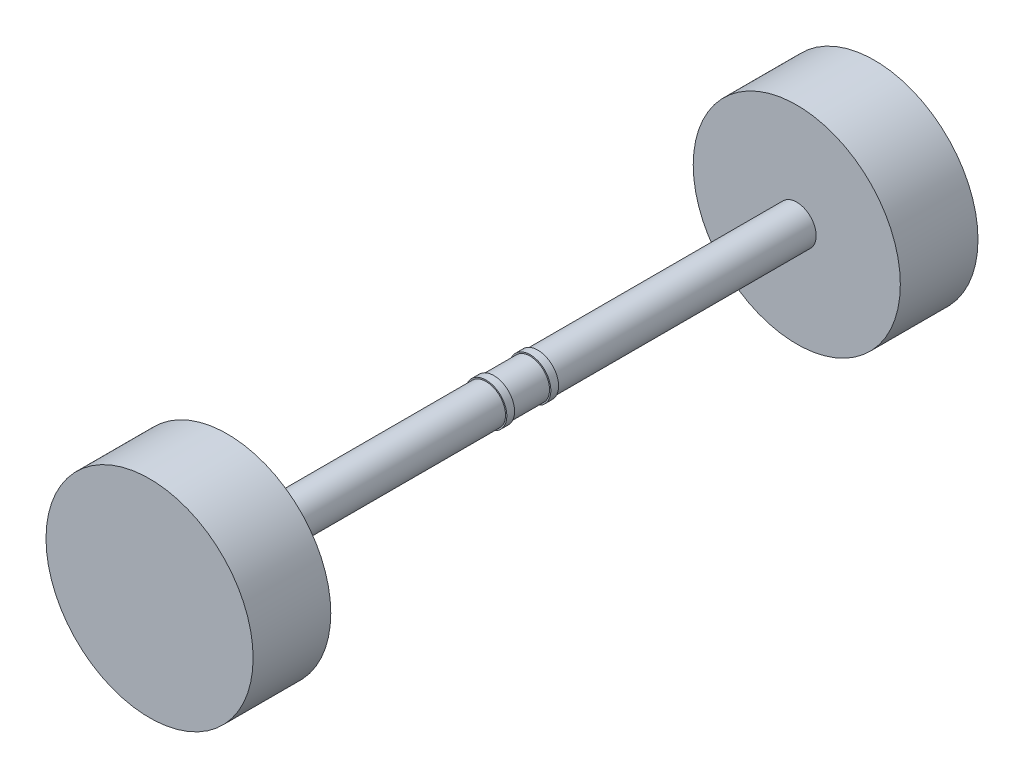
ISO-10303-21;
HEADER;
FILE_DESCRIPTION(('STEP AP214'),'2;1');
FILE_NAME('part.step','',(''),(''),'','','');
FILE_SCHEMA(('AUTOMOTIVE_DESIGN { 1 0 10303 214 1 1 1 1 }'));
ENDSEC;
DATA;
#1=APPLICATION_CONTEXT('core data for automotive mechanical design processes');
#2=APPLICATION_PROTOCOL_DEFINITION('international standard','automotive_design',2000,#1);
#3=PRODUCT_CONTEXT('',#1,'mechanical');
#4=PRODUCT('Part','Part','',(#3));
#5=PRODUCT_RELATED_PRODUCT_CATEGORY('part','',(#4));
#6=PRODUCT_DEFINITION_FORMATION('','',#4);
#7=PRODUCT_DEFINITION_CONTEXT('part definition',#1,'design');
#8=PRODUCT_DEFINITION('design','',#6,#7);
#9=PRODUCT_DEFINITION_SHAPE('','',#8);
#10=(LENGTH_UNIT() NAMED_UNIT(*) SI_UNIT(.MILLI.,.METRE.));
#11=(NAMED_UNIT(*) PLANE_ANGLE_UNIT() SI_UNIT($,.RADIAN.));
#12=(NAMED_UNIT(*) SI_UNIT($,.STERADIAN.) SOLID_ANGLE_UNIT());
#13=UNCERTAINTY_MEASURE_WITH_UNIT(LENGTH_MEASURE(1.E-05),#10,'distance_accuracy_value','');
#14=(GEOMETRIC_REPRESENTATION_CONTEXT(3) GLOBAL_UNCERTAINTY_ASSIGNED_CONTEXT((#13)) GLOBAL_UNIT_ASSIGNED_CONTEXT((#10,
#11,#12)) REPRESENTATION_CONTEXT('',''));
#15=CARTESIAN_POINT('',(0.,0.,0.));
#16=DIRECTION('',(0.,0.,1.));
#17=DIRECTION('',(1.,0.,0.));
#18=AXIS2_PLACEMENT_3D('',#15,#16,#17);
#19=CARTESIAN_POINT('',(0.,0.,76.2));
#20=DIRECTION('',(0.,0.,-1.));
#21=DIRECTION('',(-1.,0.,0.));
#22=AXIS2_PLACEMENT_3D('',#19,#20,#21);
#23=CYLINDRICAL_SURFACE('',#22,101.6);
#24=CARTESIAN_POINT('',(0.,0.,76.2));
#25=DIRECTION('',(0.,0.,1.));
#26=DIRECTION('',(1.,0.,0.));
#27=AXIS2_PLACEMENT_3D('',#24,#25,#26);
#28=CIRCLE('',#27,101.6);
#29=CARTESIAN_POINT('',(-101.6,0.,76.2));
#30=VERTEX_POINT('',#29);
#31=EDGE_CURVE('E46',#30,#30,#28,.T.);
#32=CARTESIAN_POINT('',(0.,0.,0.));
#33=DIRECTION('',(0.,0.,1.));
#34=DIRECTION('',(1.,0.,0.));
#35=AXIS2_PLACEMENT_3D('',#32,#33,#34);
#36=CIRCLE('',#35,101.6);
#37=CARTESIAN_POINT('',(-101.6,0.,0.));
#38=VERTEX_POINT('',#37);
#39=EDGE_CURVE('E37',#38,#38,#36,.T.);
#40=CARTESIAN_POINT('',(-101.6,0.,76.2));
#41=CARTESIAN_POINT('',(-101.6,0.,75.40625));
#42=CARTESIAN_POINT('',(-101.6,0.,74.6125));
#43=CARTESIAN_POINT('',(-101.6,0.,73.025));
#44=CARTESIAN_POINT('',(-101.6,0.,72.23125));
#45=CARTESIAN_POINT('',(-101.6,0.,70.64375));
#46=CARTESIAN_POINT('',(-101.6,0.,69.85));
#47=CARTESIAN_POINT('',(-101.6,0.,68.2625));
#48=CARTESIAN_POINT('',(-101.6,0.,67.46875));
#49=CARTESIAN_POINT('',(-101.6,0.,65.88125));
#50=CARTESIAN_POINT('',(-101.6,0.,65.0875));
#51=CARTESIAN_POINT('',(-101.6,0.,63.5));
#52=CARTESIAN_POINT('',(-101.6,0.,62.70625));
#53=CARTESIAN_POINT('',(-101.6,0.,61.11875));
#54=CARTESIAN_POINT('',(-101.6,0.,60.325));
#55=CARTESIAN_POINT('',(-101.6,0.,58.7375));
#56=CARTESIAN_POINT('',(-101.6,0.,57.94375));
#57=CARTESIAN_POINT('',(-101.6,0.,56.35625));
#58=CARTESIAN_POINT('',(-101.6,0.,55.5625));
#59=CARTESIAN_POINT('',(-101.6,0.,53.975));
#60=CARTESIAN_POINT('',(-101.6,0.,53.18125));
#61=CARTESIAN_POINT('',(-101.6,0.,51.59375));
#62=CARTESIAN_POINT('',(-101.6,0.,50.8));
#63=CARTESIAN_POINT('',(-101.6,0.,49.2125));
#64=CARTESIAN_POINT('',(-101.6,0.,48.41875));
#65=CARTESIAN_POINT('',(-101.6,0.,46.83125));
#66=CARTESIAN_POINT('',(-101.6,0.,46.0375));
#67=CARTESIAN_POINT('',(-101.6,0.,44.45));
#68=CARTESIAN_POINT('',(-101.6,0.,43.65625));
#69=CARTESIAN_POINT('',(-101.6,0.,42.06875));
#70=CARTESIAN_POINT('',(-101.6,0.,41.275));
#71=CARTESIAN_POINT('',(-101.6,0.,39.6875));
#72=CARTESIAN_POINT('',(-101.6,0.,38.89375));
#73=CARTESIAN_POINT('',(-101.6,0.,37.30625));
#74=CARTESIAN_POINT('',(-101.6,0.,36.5125));
#75=CARTESIAN_POINT('',(-101.6,0.,34.925));
#76=CARTESIAN_POINT('',(-101.6,0.,34.13125));
#77=CARTESIAN_POINT('',(-101.6,0.,32.54375));
#78=CARTESIAN_POINT('',(-101.6,0.,31.75));
#79=CARTESIAN_POINT('',(-101.6,0.,30.1625));
#80=CARTESIAN_POINT('',(-101.6,0.,29.36875));
#81=CARTESIAN_POINT('',(-101.6,0.,27.78125));
#82=CARTESIAN_POINT('',(-101.6,0.,26.9875));
#83=CARTESIAN_POINT('',(-101.6,0.,25.4));
#84=CARTESIAN_POINT('',(-101.6,0.,24.60625));
#85=CARTESIAN_POINT('',(-101.6,0.,23.01875));
#86=CARTESIAN_POINT('',(-101.6,0.,22.225));
#87=CARTESIAN_POINT('',(-101.6,0.,20.6375));
#88=CARTESIAN_POINT('',(-101.6,0.,19.84375));
#89=CARTESIAN_POINT('',(-101.6,0.,18.25625));
#90=CARTESIAN_POINT('',(-101.6,0.,17.4625));
#91=CARTESIAN_POINT('',(-101.6,0.,15.875));
#92=CARTESIAN_POINT('',(-101.6,0.,15.08125));
#93=CARTESIAN_POINT('',(-101.6,0.,13.49375));
#94=CARTESIAN_POINT('',(-101.6,0.,12.7));
#95=CARTESIAN_POINT('',(-101.6,0.,11.1125));
#96=CARTESIAN_POINT('',(-101.6,0.,10.31875));
#97=CARTESIAN_POINT('',(-101.6,0.,8.73125));
#98=CARTESIAN_POINT('',(-101.6,0.,7.93750000000001));
#99=CARTESIAN_POINT('',(-101.6,0.,6.35));
#100=CARTESIAN_POINT('',(-101.6,0.,5.55625));
#101=CARTESIAN_POINT('',(-101.6,0.,3.96875));
#102=CARTESIAN_POINT('',(-101.6,0.,3.175));
#103=CARTESIAN_POINT('',(-101.6,0.,1.5875));
#104=CARTESIAN_POINT('',(-101.6,0.,0.793750000000001));
#105=CARTESIAN_POINT('',(-101.6,0.,0.));
#106=B_SPLINE_CURVE_WITH_KNOTS('',3,(#40,#41,#42,#43,#44,#45,#46,#47,#48,#49,#50,#51,#52,#53,
#54,#55,#56,#57,#58,#59,#60,#61,#62,#63,#64,#65,#66,#67,#68,#69,#70,#71,#72,#73,#74,#75,#76,#77,
#78,#79,#80,#81,#82,#83,#84,#85,#86,#87,#88,#89,#90,#91,#92,#93,#94,#95,#96,#97,#98,#99,#100,
#101,#102,#103,#104,#105),.UNSPECIFIED.,.F.,.F.,(4,2,2,2,2,2,2,2,2,2,2,2,2,2,2,2,2,2,2,2,2,2,2,
2,2,2,2,2,2,2,2,2,4),(0.,2.38125,4.7625,7.14375,9.52500000000001,11.90625,14.2875,16.66875,
19.05,21.43125,23.8125,26.19375,28.575,30.95625,33.3375,35.71875,38.1,40.48125,42.8625,45.24375,
47.625,50.00625,52.3875,54.76875,57.15,59.53125,61.9125,64.29375,66.675,69.05625,71.4375,
73.81875,76.2),.UNSPECIFIED.);
#107=EDGE_CURVE('BSEAM34',#30,#38,#106,.T.);
#108=ORIENTED_EDGE('',*,*,#31,.F.);
#109=ORIENTED_EDGE('',*,*,#39,.T.);
#110=ORIENTED_EDGE('',*,*,#107,.T.);
#111=ORIENTED_EDGE('',*,*,#107,.F.);
#112=EDGE_LOOP('',(#108,#110,#109,#111));
#113=FACE_BOUND('',#112,.T.);
#114=ADVANCED_FACE('F34',(#113),#23,.T.);
#115=CARTESIAN_POINT('',(0.,0.,76.2));
#116=DIRECTION('',(0.,0.,1.));
#117=DIRECTION('',(1.,0.,0.));
#118=AXIS2_PLACEMENT_3D('',#115,#116,#117);
#119=PLANE('',#118);
#120=CARTESIAN_POINT('',(0.,0.,76.2));
#121=DIRECTION('',(0.,0.,1.));
#122=DIRECTION('',(1.,0.,0.));
#123=AXIS2_PLACEMENT_3D('',#120,#121,#122);
#124=CIRCLE('',#123,19.05);
#125=CARTESIAN_POINT('',(19.05,0.,76.2));
#126=VERTEX_POINT('',#125);
#127=EDGE_CURVE('E70',#126,#126,#124,.F.);
#128=ORIENTED_EDGE('',*,*,#127,.T.);
#129=EDGE_LOOP('',(#128));
#130=FACE_BOUND('',#129,.T.);
#131=ORIENTED_EDGE('',*,*,#31,.T.);
#132=EDGE_LOOP('',(#131));
#133=FACE_BOUND('',#132,.T.);
#134=ADVANCED_FACE('F82',(#130,#133),#119,.T.);
#135=CARTESIAN_POINT('',(0.,0.,0.));
#136=DIRECTION('',(0.,0.,1.));
#137=DIRECTION('',(1.,0.,0.));
#138=AXIS2_PLACEMENT_3D('',#135,#136,#137);
#139=PLANE('',#138);
#140=ORIENTED_EDGE('',*,*,#39,.F.);
#141=EDGE_LOOP('',(#140));
#142=FACE_BOUND('',#141,.T.);
#143=ADVANCED_FACE('F79',(#142),#139,.F.);
#144=CARTESIAN_POINT('',(0.,0.,330.2));
#145=DIRECTION('',(0.,0.,-1.));
#146=DIRECTION('',(-1.,0.,0.));
#147=AXIS2_PLACEMENT_3D('',#144,#145,#146);
#148=CYLINDRICAL_SURFACE('',#147,19.05);
#149=ORIENTED_EDGE('',*,*,#127,.F.);
#150=EDGE_LOOP('',(#149));
#151=FACE_BOUND('',#150,.T.);
#152=CARTESIAN_POINT('',(0.,0.,330.2));
#153=DIRECTION('',(0.,0.,1.));
#154=DIRECTION('',(1.,0.,0.));
#155=AXIS2_PLACEMENT_3D('',#152,#153,#154);
#156=CIRCLE('',#155,19.05);
#157=CARTESIAN_POINT('',(19.05,0.,330.2));
#158=VERTEX_POINT('',#157);
#159=EDGE_CURVE('E65',#158,#158,#156,.T.);
#160=ORIENTED_EDGE('',*,*,#159,.F.);
#161=EDGE_LOOP('',(#160));
#162=FACE_BOUND('',#161,.T.);
#163=ADVANCED_FACE('F81',(#151,#162),#148,.T.);
#164=CARTESIAN_POINT('',(0.,0.,337.82));
#165=DIRECTION('',(0.,0.,-1.));
#166=DIRECTION('',(-1.,0.,0.));
#167=AXIS2_PLACEMENT_3D('',#164,#165,#166);
#168=CYLINDRICAL_SURFACE('',#167,20.32);
#169=CARTESIAN_POINT('',(0.,0.,337.82));
#170=DIRECTION('',(0.,0.,1.));
#171=DIRECTION('',(1.,0.,0.));
#172=AXIS2_PLACEMENT_3D('',#169,#170,#171);
#173=CIRCLE('',#172,20.32);
#174=CARTESIAN_POINT('',(-20.32,0.,337.82));
#175=VERTEX_POINT('',#174);
#176=EDGE_CURVE('E62',#175,#175,#173,.T.);
#177=CARTESIAN_POINT('',(0.,0.,330.2));
#178=DIRECTION('',(0.,0.,1.));
#179=DIRECTION('',(1.,0.,0.));
#180=AXIS2_PLACEMENT_3D('',#177,#178,#179);
#181=CIRCLE('',#180,20.32);
#182=CARTESIAN_POINT('',(-20.32,0.,330.2));
#183=VERTEX_POINT('',#182);
#184=EDGE_CURVE('E60',#183,#183,#181,.T.);
#185=CARTESIAN_POINT('',(-20.32,0.,337.82));
#186=CARTESIAN_POINT('',(-20.32,0.,337.740625));
#187=CARTESIAN_POINT('',(-20.32,0.,337.66125));
#188=CARTESIAN_POINT('',(-20.32,0.,337.5025));
#189=CARTESIAN_POINT('',(-20.32,0.,337.423125));
#190=CARTESIAN_POINT('',(-20.32,0.,337.264375));
#191=CARTESIAN_POINT('',(-20.32,0.,337.185));
#192=CARTESIAN_POINT('',(-20.32,0.,337.02625));
#193=CARTESIAN_POINT('',(-20.32,0.,336.946875));
#194=CARTESIAN_POINT('',(-20.32,0.,336.788125));
#195=CARTESIAN_POINT('',(-20.32,0.,336.70875));
#196=CARTESIAN_POINT('',(-20.32,0.,336.55));
#197=CARTESIAN_POINT('',(-20.32,0.,336.470625));
#198=CARTESIAN_POINT('',(-20.32,0.,336.311875));
#199=CARTESIAN_POINT('',(-20.32,0.,336.2325));
#200=CARTESIAN_POINT('',(-20.32,0.,336.07375));
#201=CARTESIAN_POINT('',(-20.32,0.,335.994375));
#202=CARTESIAN_POINT('',(-20.32,0.,335.835625));
#203=CARTESIAN_POINT('',(-20.32,0.,335.75625));
#204=CARTESIAN_POINT('',(-20.32,0.,335.5975));
#205=CARTESIAN_POINT('',(-20.32,0.,335.518125));
#206=CARTESIAN_POINT('',(-20.32,0.,335.359375));
#207=CARTESIAN_POINT('',(-20.32,0.,335.28));
#208=CARTESIAN_POINT('',(-20.32,0.,335.12125));
#209=CARTESIAN_POINT('',(-20.32,0.,335.041875));
#210=CARTESIAN_POINT('',(-20.32,0.,334.883125));
#211=CARTESIAN_POINT('',(-20.32,0.,334.80375));
#212=CARTESIAN_POINT('',(-20.32,0.,334.645));
#213=CARTESIAN_POINT('',(-20.32,0.,334.565625));
#214=CARTESIAN_POINT('',(-20.32,0.,334.406875));
#215=CARTESIAN_POINT('',(-20.32,0.,334.3275));
#216=CARTESIAN_POINT('',(-20.32,0.,334.16875));
#217=CARTESIAN_POINT('',(-20.32,0.,334.089375));
#218=CARTESIAN_POINT('',(-20.32,0.,333.930625));
#219=CARTESIAN_POINT('',(-20.32,0.,333.85125));
#220=CARTESIAN_POINT('',(-20.32,0.,333.6925));
#221=CARTESIAN_POINT('',(-20.32,0.,333.613125));
#222=CARTESIAN_POINT('',(-20.32,0.,333.454375));
#223=CARTESIAN_POINT('',(-20.32,0.,333.375));
#224=CARTESIAN_POINT('',(-20.32,0.,333.21625));
#225=CARTESIAN_POINT('',(-20.32,0.,333.136875));
#226=CARTESIAN_POINT('',(-20.32,0.,332.978125));
#227=CARTESIAN_POINT('',(-20.32,0.,332.89875));
#228=CARTESIAN_POINT('',(-20.32,0.,332.74));
#229=CARTESIAN_POINT('',(-20.32,0.,332.660625));
#230=CARTESIAN_POINT('',(-20.32,0.,332.501875));
#231=CARTESIAN_POINT('',(-20.32,0.,332.4225));
#232=CARTESIAN_POINT('',(-20.32,0.,332.26375));
#233=CARTESIAN_POINT('',(-20.32,0.,332.184375));
#234=CARTESIAN_POINT('',(-20.32,0.,332.025625));
#235=CARTESIAN_POINT('',(-20.32,0.,331.94625));
#236=CARTESIAN_POINT('',(-20.32,0.,331.7875));
#237=CARTESIAN_POINT('',(-20.32,0.,331.708125));
#238=CARTESIAN_POINT('',(-20.32,0.,331.549375));
#239=CARTESIAN_POINT('',(-20.32,0.,331.47));
#240=CARTESIAN_POINT('',(-20.32,0.,331.31125));
#241=CARTESIAN_POINT('',(-20.32,0.,331.231875));
#242=CARTESIAN_POINT('',(-20.32,0.,331.073125));
#243=CARTESIAN_POINT('',(-20.32,0.,330.99375));
#244=CARTESIAN_POINT('',(-20.32,0.,330.835));
#245=CARTESIAN_POINT('',(-20.32,0.,330.755625));
#246=CARTESIAN_POINT('',(-20.32,0.,330.596875));
#247=CARTESIAN_POINT('',(-20.32,0.,330.5175));
#248=CARTESIAN_POINT('',(-20.32,0.,330.35875));
#249=CARTESIAN_POINT('',(-20.32,0.,330.279375));
#250=CARTESIAN_POINT('',(-20.32,0.,330.2));
#251=B_SPLINE_CURVE_WITH_KNOTS('',3,(#185,#186,#187,#188,#189,#190,#191,#192,#193,#194,#195,
#196,#197,#198,#199,#200,#201,#202,#203,#204,#205,#206,#207,#208,#209,#210,#211,#212,#213,#214,
#215,#216,#217,#218,#219,#220,#221,#222,#223,#224,#225,#226,#227,#228,#229,#230,#231,#232,#233,
#234,#235,#236,#237,#238,#239,#240,#241,#242,#243,#244,#245,#246,#247,#248,#249,#250),
.UNSPECIFIED.,.F.,.F.,(4,2,2,2,2,2,2,2,2,2,2,2,2,2,2,2,2,2,2,2,2,2,2,2,2,2,2,2,2,2,2,2,4),(0.,
0.238124999999978,0.476249999999956,0.714374999999989,0.952499999999967,1.190625,
1.42874999999998,1.66687499999996,1.90499999999999,2.14312499999997,2.38125,2.61937499999998,
2.85749999999996,3.09562499999999,3.33374999999997,3.571875,3.80999999999998,4.04812499999996,
4.28624999999999,4.52437499999997,4.7625,5.00062499999998,5.23874999999996,5.47687499999999,
5.71499999999997,5.953125,6.19124999999998,6.42937499999996,6.66749999999999,6.90562499999997,
7.14375,7.38187499999998,7.61999999999996),.UNSPECIFIED.);
#252=EDGE_CURVE('BSEAM87',#175,#183,#251,.T.);
#253=ORIENTED_EDGE('',*,*,#176,.F.);
#254=ORIENTED_EDGE('',*,*,#184,.T.);
#255=ORIENTED_EDGE('',*,*,#252,.T.);
#256=ORIENTED_EDGE('',*,*,#252,.F.);
#257=EDGE_LOOP('',(#253,#255,#254,#256));
#258=FACE_BOUND('',#257,.T.);
#259=ADVANCED_FACE('F87',(#258),#168,.T.);
#260=CARTESIAN_POINT('',(0.,0.,337.82));
#261=DIRECTION('',(0.,0.,1.));
#262=DIRECTION('',(1.,0.,0.));
#263=AXIS2_PLACEMENT_3D('',#260,#261,#262);
#264=PLANE('',#263);
#265=CARTESIAN_POINT('',(0.,0.,337.82));
#266=DIRECTION('',(0.,0.,1.));
#267=DIRECTION('',(1.,0.,0.));
#268=AXIS2_PLACEMENT_3D('',#265,#266,#267);
#269=CIRCLE('',#268,19.05);
#270=CARTESIAN_POINT('',(19.05,0.,337.82));
#271=VERTEX_POINT('',#270);
#272=EDGE_CURVE('E41',#271,#271,#269,.T.);
#273=ORIENTED_EDGE('',*,*,#272,.F.);
#274=EDGE_LOOP('',(#273));
#275=FACE_BOUND('',#274,.T.);
#276=ORIENTED_EDGE('',*,*,#176,.T.);
#277=EDGE_LOOP('',(#276));
#278=FACE_BOUND('',#277,.T.);
#279=ADVANCED_FACE('F119',(#275,#278),#264,.T.);
#280=CARTESIAN_POINT('',(0.,0.,330.2));
#281=DIRECTION('',(0.,0.,1.));
#282=DIRECTION('',(1.,0.,0.));
#283=AXIS2_PLACEMENT_3D('',#280,#281,#282);
#284=PLANE('',#283);
#285=ORIENTED_EDGE('',*,*,#159,.T.);
#286=EDGE_LOOP('',(#285));
#287=FACE_BOUND('',#286,.T.);
#288=ORIENTED_EDGE('',*,*,#184,.F.);
#289=EDGE_LOOP('',(#288));
#290=FACE_BOUND('',#289,.T.);
#291=ADVANCED_FACE('F127',(#287,#290),#284,.F.);
#292=CARTESIAN_POINT('',(0.,0.,373.38));
#293=DIRECTION('',(0.,0.,-1.));
#294=DIRECTION('',(-1.,0.,0.));
#295=AXIS2_PLACEMENT_3D('',#292,#293,#294);
#296=CYLINDRICAL_SURFACE('',#295,19.05);
#297=CARTESIAN_POINT('',(0.,0.,373.38));
#298=DIRECTION('',(0.,0.,1.));
#299=DIRECTION('',(1.,0.,0.));
#300=AXIS2_PLACEMENT_3D('',#297,#298,#299);
#301=CIRCLE('',#300,19.05);
#302=CARTESIAN_POINT('',(19.05,0.,373.38));
#303=VERTEX_POINT('',#302);
#304=EDGE_CURVE('E55',#303,#303,#301,.T.);
#305=ORIENTED_EDGE('',*,*,#304,.F.);
#306=EDGE_LOOP('',(#305));
#307=FACE_BOUND('',#306,.T.);
#308=ORIENTED_EDGE('',*,*,#272,.T.);
#309=EDGE_LOOP('',(#308));
#310=FACE_BOUND('',#309,.T.);
#311=ADVANCED_FACE('F132',(#307,#310),#296,.T.);
#312=CARTESIAN_POINT('',(0.,0.,381.));
#313=DIRECTION('',(0.,0.,-1.));
#314=DIRECTION('',(-1.,0.,0.));
#315=AXIS2_PLACEMENT_3D('',#312,#313,#314);
#316=CYLINDRICAL_SURFACE('',#315,20.32);
#317=CARTESIAN_POINT('',(0.,0.,381.));
#318=DIRECTION('',(0.,0.,1.));
#319=DIRECTION('',(1.,0.,0.));
#320=AXIS2_PLACEMENT_3D('',#317,#318,#319);
#321=CIRCLE('',#320,20.32);
#322=CARTESIAN_POINT('',(-20.32,0.,381.));
#323=VERTEX_POINT('',#322);
#324=EDGE_CURVE('E52',#323,#323,#321,.T.);
#325=CARTESIAN_POINT('',(0.,0.,373.38));
#326=DIRECTION('',(0.,0.,1.));
#327=DIRECTION('',(1.,0.,0.));
#328=AXIS2_PLACEMENT_3D('',#325,#326,#327);
#329=CIRCLE('',#328,20.32);
#330=CARTESIAN_POINT('',(-20.32,0.,373.38));
#331=VERTEX_POINT('',#330);
#332=EDGE_CURVE('E56',#331,#331,#329,.T.);
#333=CARTESIAN_POINT('',(-20.32,0.,381.));
#334=CARTESIAN_POINT('',(-20.32,0.,380.920625));
#335=CARTESIAN_POINT('',(-20.32,0.,380.84125));
#336=CARTESIAN_POINT('',(-20.32,0.,380.6825));
#337=CARTESIAN_POINT('',(-20.32,0.,380.603125));
#338=CARTESIAN_POINT('',(-20.32,0.,380.444375));
#339=CARTESIAN_POINT('',(-20.32,0.,380.365));
#340=CARTESIAN_POINT('',(-20.32,0.,380.20625));
#341=CARTESIAN_POINT('',(-20.32,0.,380.126875));
#342=CARTESIAN_POINT('',(-20.32,0.,379.968125));
#343=CARTESIAN_POINT('',(-20.32,0.,379.88875));
#344=CARTESIAN_POINT('',(-20.32,0.,379.73));
#345=CARTESIAN_POINT('',(-20.32,0.,379.650625));
#346=CARTESIAN_POINT('',(-20.32,0.,379.491875));
#347=CARTESIAN_POINT('',(-20.32,0.,379.4125));
#348=CARTESIAN_POINT('',(-20.32,0.,379.25375));
#349=CARTESIAN_POINT('',(-20.32,0.,379.174375));
#350=CARTESIAN_POINT('',(-20.32,0.,379.015625));
#351=CARTESIAN_POINT('',(-20.32,0.,378.93625));
#352=CARTESIAN_POINT('',(-20.32,0.,378.7775));
#353=CARTESIAN_POINT('',(-20.32,0.,378.698125));
#354=CARTESIAN_POINT('',(-20.32,0.,378.539375));
#355=CARTESIAN_POINT('',(-20.32,0.,378.46));
#356=CARTESIAN_POINT('',(-20.32,0.,378.30125));
#357=CARTESIAN_POINT('',(-20.32,0.,378.221875));
#358=CARTESIAN_POINT('',(-20.32,0.,378.063125));
#359=CARTESIAN_POINT('',(-20.32,0.,377.98375));
#360=CARTESIAN_POINT('',(-20.32,0.,377.825));
#361=CARTESIAN_POINT('',(-20.32,0.,377.745625));
#362=CARTESIAN_POINT('',(-20.32,0.,377.586875));
#363=CARTESIAN_POINT('',(-20.32,0.,377.5075));
#364=CARTESIAN_POINT('',(-20.32,0.,377.34875));
#365=CARTESIAN_POINT('',(-20.32,0.,377.269375));
#366=CARTESIAN_POINT('',(-20.32,0.,377.110625));
#367=CARTESIAN_POINT('',(-20.32,0.,377.03125));
#368=CARTESIAN_POINT('',(-20.32,0.,376.8725));
#369=CARTESIAN_POINT('',(-20.32,0.,376.793125));
#370=CARTESIAN_POINT('',(-20.32,0.,376.634375));
#371=CARTESIAN_POINT('',(-20.32,0.,376.555));
#372=CARTESIAN_POINT('',(-20.32,0.,376.39625));
#373=CARTESIAN_POINT('',(-20.32,0.,376.316875));
#374=CARTESIAN_POINT('',(-20.32,0.,376.158125));
#375=CARTESIAN_POINT('',(-20.32,0.,376.07875));
#376=CARTESIAN_POINT('',(-20.32,0.,375.92));
#377=CARTESIAN_POINT('',(-20.32,0.,375.840625));
#378=CARTESIAN_POINT('',(-20.32,0.,375.681875));
#379=CARTESIAN_POINT('',(-20.32,0.,375.6025));
#380=CARTESIAN_POINT('',(-20.32,0.,375.44375));
#381=CARTESIAN_POINT('',(-20.32,0.,375.364375));
#382=CARTESIAN_POINT('',(-20.32,0.,375.205625));
#383=CARTESIAN_POINT('',(-20.32,0.,375.12625));
#384=CARTESIAN_POINT('',(-20.32,0.,374.9675));
#385=CARTESIAN_POINT('',(-20.32,0.,374.888125));
#386=CARTESIAN_POINT('',(-20.32,0.,374.729375));
#387=CARTESIAN_POINT('',(-20.32,0.,374.65));
#388=CARTESIAN_POINT('',(-20.32,0.,374.49125));
#389=CARTESIAN_POINT('',(-20.32,0.,374.411875));
#390=CARTESIAN_POINT('',(-20.32,0.,374.253125));
#391=CARTESIAN_POINT('',(-20.32,0.,374.17375));
#392=CARTESIAN_POINT('',(-20.32,0.,374.015));
#393=CARTESIAN_POINT('',(-20.32,0.,373.935625));
#394=CARTESIAN_POINT('',(-20.32,0.,373.776875));
#395=CARTESIAN_POINT('',(-20.32,0.,373.6975));
#396=CARTESIAN_POINT('',(-20.32,0.,373.53875));
#397=CARTESIAN_POINT('',(-20.32,0.,373.459375));
#398=CARTESIAN_POINT('',(-20.32,0.,373.38));
#399=B_SPLINE_CURVE_WITH_KNOTS('',3,(#333,#334,#335,#336,#337,#338,#339,#340,#341,#342,#343,
#344,#345,#346,#347,#348,#349,#350,#351,#352,#353,#354,#355,#356,#357,#358,#359,#360,#361,#362,
#363,#364,#365,#366,#367,#368,#369,#370,#371,#372,#373,#374,#375,#376,#377,#378,#379,#380,#381,
#382,#383,#384,#385,#386,#387,#388,#389,#390,#391,#392,#393,#394,#395,#396,#397,#398),
.UNSPECIFIED.,.F.,.F.,(4,2,2,2,2,2,2,2,2,2,2,2,2,2,2,2,2,2,2,2,2,2,2,2,2,2,2,2,2,2,2,2,4),(0.,
0.238124999999978,0.476249999999956,0.714374999999989,0.952499999999967,1.190625,
1.42874999999998,1.66687499999996,1.90499999999999,2.14312499999997,2.38125,2.61937499999998,
2.85749999999996,3.09562499999999,3.33374999999997,3.571875,3.80999999999998,4.04812499999996,
4.28624999999999,4.52437499999997,4.7625,5.00062499999998,5.23874999999996,5.47687499999999,
5.71499999999997,5.953125,6.19124999999998,6.42937499999996,6.66749999999999,6.90562499999997,
7.14375,7.38187499999998,7.61999999999996),.UNSPECIFIED.);
#400=EDGE_CURVE('BSEAM149',#323,#331,#399,.T.);
#401=ORIENTED_EDGE('',*,*,#324,.F.);
#402=ORIENTED_EDGE('',*,*,#332,.T.);
#403=ORIENTED_EDGE('',*,*,#400,.T.);
#404=ORIENTED_EDGE('',*,*,#400,.F.);
#405=EDGE_LOOP('',(#401,#403,#402,#404));
#406=FACE_BOUND('',#405,.T.);
#407=ADVANCED_FACE('F149',(#406),#316,.T.);
#408=CARTESIAN_POINT('',(0.,0.,381.));
#409=DIRECTION('',(0.,0.,1.));
#410=DIRECTION('',(1.,0.,0.));
#411=AXIS2_PLACEMENT_3D('',#408,#409,#410);
#412=PLANE('',#411);
#413=CARTESIAN_POINT('',(0.,0.,381.));
#414=DIRECTION('',(0.,0.,1.));
#415=DIRECTION('',(1.,0.,0.));
#416=AXIS2_PLACEMENT_3D('',#413,#414,#415);
#417=CIRCLE('',#416,19.05);
#418=CARTESIAN_POINT('',(19.05,0.,381.));
#419=VERTEX_POINT('',#418);
#420=EDGE_CURVE('E10',#419,#419,#417,.T.);
#421=ORIENTED_EDGE('',*,*,#420,.F.);
#422=EDGE_LOOP('',(#421));
#423=FACE_BOUND('',#422,.T.);
#424=ORIENTED_EDGE('',*,*,#324,.T.);
#425=EDGE_LOOP('',(#424));
#426=FACE_BOUND('',#425,.T.);
#427=ADVANCED_FACE('F159',(#423,#426),#412,.T.);
#428=CARTESIAN_POINT('',(0.,0.,373.38));
#429=DIRECTION('',(0.,0.,1.));
#430=DIRECTION('',(1.,0.,0.));
#431=AXIS2_PLACEMENT_3D('',#428,#429,#430);
#432=PLANE('',#431);
#433=ORIENTED_EDGE('',*,*,#304,.T.);
#434=EDGE_LOOP('',(#433));
#435=FACE_BOUND('',#434,.T.);
#436=ORIENTED_EDGE('',*,*,#332,.F.);
#437=EDGE_LOOP('',(#436));
#438=FACE_BOUND('',#437,.T.);
#439=ADVANCED_FACE('F167',(#435,#438),#432,.F.);
#440=CARTESIAN_POINT('',(0.,0.,635.));
#441=DIRECTION('',(0.,0.,-1.));
#442=DIRECTION('',(-1.,0.,0.));
#443=AXIS2_PLACEMENT_3D('',#440,#441,#442);
#444=CYLINDRICAL_SURFACE('',#443,19.05);
#445=CARTESIAN_POINT('',(0.,0.,635.));
#446=DIRECTION('',(0.,0.,1.));
#447=DIRECTION('',(1.,0.,0.));
#448=AXIS2_PLACEMENT_3D('',#445,#446,#447);
#449=CIRCLE('',#448,19.05);
#450=CARTESIAN_POINT('',(19.05,0.,635.));
#451=VERTEX_POINT('',#450);
#452=EDGE_CURVE('E50',#451,#451,#449,.T.);
#453=ORIENTED_EDGE('',*,*,#452,.F.);
#454=EDGE_LOOP('',(#453));
#455=FACE_BOUND('',#454,.T.);
#456=ORIENTED_EDGE('',*,*,#420,.T.);
#457=EDGE_LOOP('',(#456));
#458=FACE_BOUND('',#457,.T.);
#459=ADVANCED_FACE('F172',(#455,#458),#444,.T.);
#460=CARTESIAN_POINT('',(0.,0.,711.2));
#461=DIRECTION('',(0.,0.,-1.));
#462=DIRECTION('',(-1.,0.,0.));
#463=AXIS2_PLACEMENT_3D('',#460,#461,#462);
#464=CYLINDRICAL_SURFACE('',#463,101.6);
#465=CARTESIAN_POINT('',(0.,0.,711.2));
#466=DIRECTION('',(0.,0.,1.));
#467=DIRECTION('',(1.,0.,0.));
#468=AXIS2_PLACEMENT_3D('',#465,#466,#467);
#469=CIRCLE('',#468,101.6);
#470=CARTESIAN_POINT('',(-101.6,0.,711.2));
#471=VERTEX_POINT('',#470);
#472=EDGE_CURVE('E230',#471,#471,#469,.T.);
#473=CARTESIAN_POINT('',(0.,0.,635.));
#474=DIRECTION('',(0.,0.,1.));
#475=DIRECTION('',(1.,0.,0.));
#476=AXIS2_PLACEMENT_3D('',#473,#474,#475);
#477=CIRCLE('',#476,101.6);
#478=CARTESIAN_POINT('',(-101.6,0.,635.));
#479=VERTEX_POINT('',#478);
#480=EDGE_CURVE('E228',#479,#479,#477,.T.);
#481=CARTESIAN_POINT('',(-101.6,0.,711.2));
#482=CARTESIAN_POINT('',(-101.6,0.,710.40625));
#483=CARTESIAN_POINT('',(-101.6,0.,709.6125));
#484=CARTESIAN_POINT('',(-101.6,0.,708.025));
#485=CARTESIAN_POINT('',(-101.6,0.,707.23125));
#486=CARTESIAN_POINT('',(-101.6,0.,705.64375));
#487=CARTESIAN_POINT('',(-101.6,0.,704.85));
#488=CARTESIAN_POINT('',(-101.6,0.,703.2625));
#489=CARTESIAN_POINT('',(-101.6,0.,702.46875));
#490=CARTESIAN_POINT('',(-101.6,0.,700.88125));
#491=CARTESIAN_POINT('',(-101.6,0.,700.0875));
#492=CARTESIAN_POINT('',(-101.6,0.,698.5));
#493=CARTESIAN_POINT('',(-101.6,0.,697.70625));
#494=CARTESIAN_POINT('',(-101.6,0.,696.11875));
#495=CARTESIAN_POINT('',(-101.6,0.,695.325));
#496=CARTESIAN_POINT('',(-101.6,0.,693.7375));
#497=CARTESIAN_POINT('',(-101.6,0.,692.94375));
#498=CARTESIAN_POINT('',(-101.6,0.,691.35625));
#499=CARTESIAN_POINT('',(-101.6,0.,690.5625));
#500=CARTESIAN_POINT('',(-101.6,0.,688.975));
#501=CARTESIAN_POINT('',(-101.6,0.,688.18125));
#502=CARTESIAN_POINT('',(-101.6,0.,686.59375));
#503=CARTESIAN_POINT('',(-101.6,0.,685.8));
#504=CARTESIAN_POINT('',(-101.6,0.,684.2125));
#505=CARTESIAN_POINT('',(-101.6,0.,683.41875));
#506=CARTESIAN_POINT('',(-101.6,0.,681.83125));
#507=CARTESIAN_POINT('',(-101.6,0.,681.0375));
#508=CARTESIAN_POINT('',(-101.6,0.,679.45));
#509=CARTESIAN_POINT('',(-101.6,0.,678.65625));
#510=CARTESIAN_POINT('',(-101.6,0.,677.06875));
#511=CARTESIAN_POINT('',(-101.6,0.,676.275));
#512=CARTESIAN_POINT('',(-101.6,0.,674.6875));
#513=CARTESIAN_POINT('',(-101.6,0.,673.89375));
#514=CARTESIAN_POINT('',(-101.6,0.,672.30625));
#515=CARTESIAN_POINT('',(-101.6,0.,671.5125));
#516=CARTESIAN_POINT('',(-101.6,0.,669.925));
#517=CARTESIAN_POINT('',(-101.6,0.,669.13125));
#518=CARTESIAN_POINT('',(-101.6,0.,667.54375));
#519=CARTESIAN_POINT('',(-101.6,0.,666.75));
#520=CARTESIAN_POINT('',(-101.6,0.,665.1625));
#521=CARTESIAN_POINT('',(-101.6,0.,664.36875));
#522=CARTESIAN_POINT('',(-101.6,0.,662.78125));
#523=CARTESIAN_POINT('',(-101.6,0.,661.9875));
#524=CARTESIAN_POINT('',(-101.6,0.,660.4));
#525=CARTESIAN_POINT('',(-101.6,0.,659.60625));
#526=CARTESIAN_POINT('',(-101.6,0.,658.01875));
#527=CARTESIAN_POINT('',(-101.6,0.,657.225));
#528=CARTESIAN_POINT('',(-101.6,0.,655.6375));
#529=CARTESIAN_POINT('',(-101.6,0.,654.84375));
#530=CARTESIAN_POINT('',(-101.6,0.,653.25625));
#531=CARTESIAN_POINT('',(-101.6,0.,652.4625));
#532=CARTESIAN_POINT('',(-101.6,0.,650.875));
#533=CARTESIAN_POINT('',(-101.6,0.,650.08125));
#534=CARTESIAN_POINT('',(-101.6,0.,648.49375));
#535=CARTESIAN_POINT('',(-101.6,0.,647.7));
#536=CARTESIAN_POINT('',(-101.6,0.,646.1125));
#537=CARTESIAN_POINT('',(-101.6,0.,645.31875));
#538=CARTESIAN_POINT('',(-101.6,0.,643.73125));
#539=CARTESIAN_POINT('',(-101.6,0.,642.9375));
#540=CARTESIAN_POINT('',(-101.6,0.,641.35));
#541=CARTESIAN_POINT('',(-101.6,0.,640.55625));
#542=CARTESIAN_POINT('',(-101.6,0.,638.96875));
#543=CARTESIAN_POINT('',(-101.6,0.,638.175));
#544=CARTESIAN_POINT('',(-101.6,0.,636.5875));
#545=CARTESIAN_POINT('',(-101.6,0.,635.79375));
#546=CARTESIAN_POINT('',(-101.6,0.,635.));
#547=B_SPLINE_CURVE_WITH_KNOTS('',3,(#481,#482,#483,#484,#485,#486,#487,#488,#489,#490,#491,
#492,#493,#494,#495,#496,#497,#498,#499,#500,#501,#502,#503,#504,#505,#506,#507,#508,#509,#510,
#511,#512,#513,#514,#515,#516,#517,#518,#519,#520,#521,#522,#523,#524,#525,#526,#527,#528,#529,
#530,#531,#532,#533,#534,#535,#536,#537,#538,#539,#540,#541,#542,#543,#544,#545,#546),
.UNSPECIFIED.,.F.,.F.,(4,2,2,2,2,2,2,2,2,2,2,2,2,2,2,2,2,2,2,2,2,2,2,2,2,2,2,2,2,2,2,2,4),(0.,
2.38125,4.7625,7.14375,9.52500000000001,11.90625,14.2875,16.66875,19.05,21.43125,23.8125,
26.19375,28.575,30.95625,33.3375,35.71875,38.1,40.48125,42.8625,45.24375,47.625,50.00625,
52.3875,54.76875,57.15,59.53125,61.9125,64.29375,66.675,69.05625,71.4375,73.8187500000001,76.2),.UNSPECIFIED.);
#548=EDGE_CURVE('BSEAM189',#471,#479,#547,.T.);
#549=ORIENTED_EDGE('',*,*,#472,.F.);
#550=ORIENTED_EDGE('',*,*,#480,.T.);
#551=ORIENTED_EDGE('',*,*,#548,.T.);
#552=ORIENTED_EDGE('',*,*,#548,.F.);
#553=EDGE_LOOP('',(#549,#551,#550,#552));
#554=FACE_BOUND('',#553,.T.);
#555=ADVANCED_FACE('F189',(#554),#464,.T.);
#556=CARTESIAN_POINT('',(0.,0.,711.2));
#557=DIRECTION('',(0.,0.,1.));
#558=DIRECTION('',(1.,0.,0.));
#559=AXIS2_PLACEMENT_3D('',#556,#557,#558);
#560=PLANE('',#559);
#561=ORIENTED_EDGE('',*,*,#472,.T.);
#562=EDGE_LOOP('',(#561));
#563=FACE_BOUND('',#562,.T.);
#564=ADVANCED_FACE('F199',(#563),#560,.T.);
#565=CARTESIAN_POINT('',(0.,0.,635.));
#566=DIRECTION('',(0.,0.,1.));
#567=DIRECTION('',(1.,0.,0.));
#568=AXIS2_PLACEMENT_3D('',#565,#566,#567);
#569=PLANE('',#568);
#570=ORIENTED_EDGE('',*,*,#452,.T.);
#571=EDGE_LOOP('',(#570));
#572=FACE_BOUND('',#571,.T.);
#573=ORIENTED_EDGE('',*,*,#480,.F.);
#574=EDGE_LOOP('',(#573));
#575=FACE_BOUND('',#574,.T.);
#576=ADVANCED_FACE('F209',(#572,#575),#569,.F.);
#577=CLOSED_SHELL('',(#114,#134,#143,#163,#259,#279,#291,#311,#407,#427,#439,#459,#555,#564,#576));
#578=MANIFOLD_SOLID_BREP('B2',#577);
#579=ADVANCED_BREP_SHAPE_REPRESENTATION('',(#18,#578),#14);
#580=SHAPE_DEFINITION_REPRESENTATION(#9,#579);
ENDSEC;
END-ISO-10303-21;
